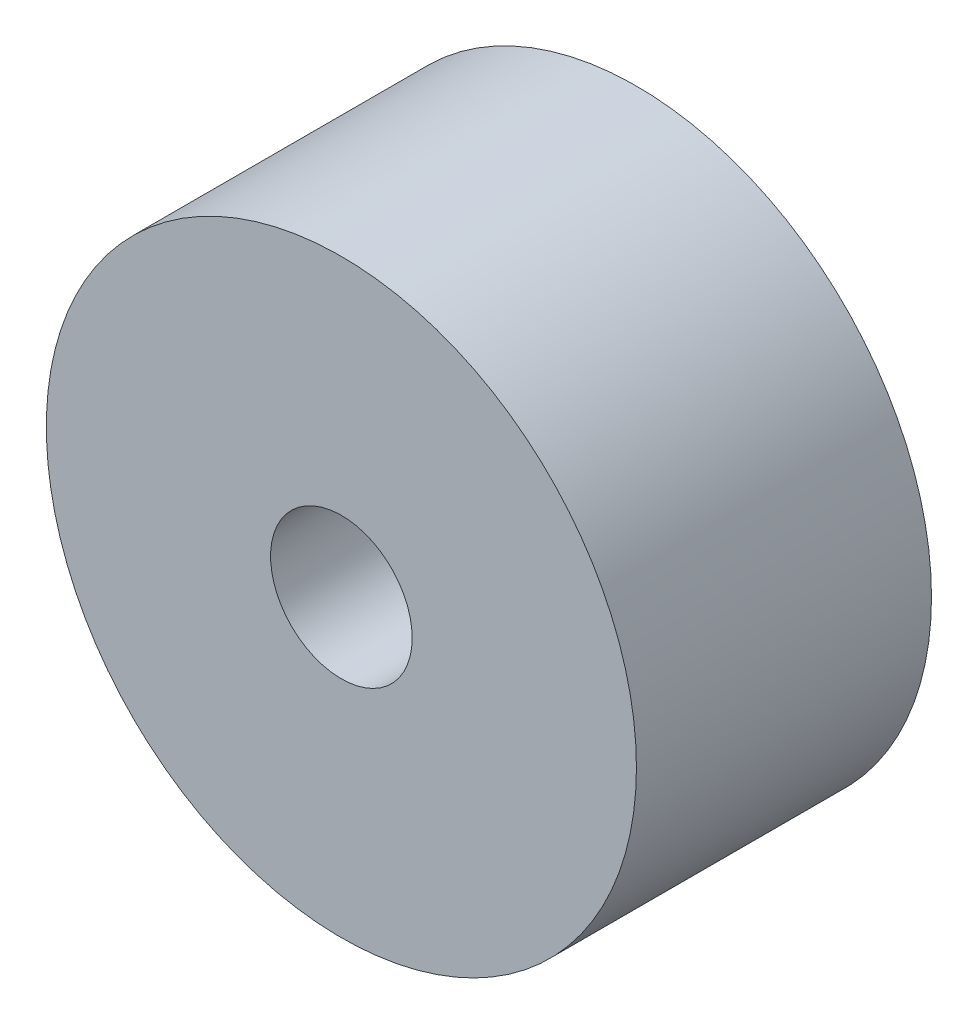
ISO-10303-21;
HEADER;
FILE_DESCRIPTION(('STEP AP214'),'2;1');
FILE_NAME('part.step','',(''),(''),'','','');
FILE_SCHEMA(('AUTOMOTIVE_DESIGN { 1 0 10303 214 1 1 1 1 }'));
ENDSEC;
DATA;
#1=APPLICATION_CONTEXT('core data for automotive mechanical design processes');
#2=APPLICATION_PROTOCOL_DEFINITION('international standard','automotive_design',2000,#1);
#3=PRODUCT_CONTEXT('',#1,'mechanical');
#4=PRODUCT('Part','Part','',(#3));
#5=PRODUCT_RELATED_PRODUCT_CATEGORY('part','',(#4));
#6=PRODUCT_DEFINITION_FORMATION('','',#4);
#7=PRODUCT_DEFINITION_CONTEXT('part definition',#1,'design');
#8=PRODUCT_DEFINITION('design','',#6,#7);
#9=PRODUCT_DEFINITION_SHAPE('','',#8);
#10=(LENGTH_UNIT() NAMED_UNIT(*) SI_UNIT(.MILLI.,.METRE.));
#11=(NAMED_UNIT(*) PLANE_ANGLE_UNIT() SI_UNIT($,.RADIAN.));
#12=(NAMED_UNIT(*) SI_UNIT($,.STERADIAN.) SOLID_ANGLE_UNIT());
#13=UNCERTAINTY_MEASURE_WITH_UNIT(LENGTH_MEASURE(1.E-05),#10,'distance_accuracy_value','');
#14=(GEOMETRIC_REPRESENTATION_CONTEXT(3) GLOBAL_UNCERTAINTY_ASSIGNED_CONTEXT((#13)) GLOBAL_UNIT_ASSIGNED_CONTEXT((#10,
#11,#12)) REPRESENTATION_CONTEXT('',''));
#15=CARTESIAN_POINT('',(0.,0.,0.));
#16=DIRECTION('',(0.,0.,1.));
#17=DIRECTION('',(1.,0.,0.));
#18=AXIS2_PLACEMENT_3D('',#15,#16,#17);
#19=CARTESIAN_POINT('',(0.,0.,5.));
#20=DIRECTION('',(0.,0.,1.));
#21=DIRECTION('',(1.,0.,0.));
#22=AXIS2_PLACEMENT_3D('',#19,#20,#21);
#23=PLANE('',#22);
#24=CARTESIAN_POINT('',(0.,0.,5.));
#25=DIRECTION('',(0.,0.,1.));
#26=DIRECTION('',(1.,0.,0.));
#27=AXIS2_PLACEMENT_3D('',#24,#25,#26);
#28=CIRCLE('',#27,5.);
#29=CARTESIAN_POINT('',(5.,0.,5.));
#30=VERTEX_POINT('',#29);
#31=EDGE_CURVE('E11',#30,#30,#28,.T.);
#32=ORIENTED_EDGE('',*,*,#31,.T.);
#33=EDGE_LOOP('',(#32));
#34=FACE_BOUND('',#33,.T.);
#35=CARTESIAN_POINT('',(0.,0.,5.));
#36=DIRECTION('',(0.,0.,1.));
#37=DIRECTION('',(1.,0.,0.));
#38=AXIS2_PLACEMENT_3D('',#35,#36,#37);
#39=CIRCLE('',#38,1.2);
#40=CARTESIAN_POINT('',(1.2,0.,5.));
#41=VERTEX_POINT('',#40);
#42=EDGE_CURVE('E47',#41,#41,#39,.T.);
#43=ORIENTED_EDGE('',*,*,#42,.F.);
#44=EDGE_LOOP('',(#43));
#45=FACE_BOUND('',#44,.T.);
#46=ADVANCED_FACE('F34',(#34,#45),#23,.T.);
#47=CARTESIAN_POINT('',(0.,0.,0.));
#48=DIRECTION('',(0.,0.,1.));
#49=DIRECTION('',(1.,0.,0.));
#50=AXIS2_PLACEMENT_3D('',#47,#48,#49);
#51=PLANE('',#50);
#52=CARTESIAN_POINT('',(0.,0.,0.));
#53=DIRECTION('',(0.,0.,1.));
#54=DIRECTION('',(1.,0.,0.));
#55=AXIS2_PLACEMENT_3D('',#52,#53,#54);
#56=CIRCLE('',#55,5.);
#57=CARTESIAN_POINT('',(5.,0.,0.));
#58=VERTEX_POINT('',#57);
#59=EDGE_CURVE('E38',#58,#58,#56,.T.);
#60=ORIENTED_EDGE('',*,*,#59,.F.);
#61=EDGE_LOOP('',(#60));
#62=FACE_BOUND('',#61,.T.);
#63=CARTESIAN_POINT('',(0.,0.,0.));
#64=DIRECTION('',(0.,0.,1.));
#65=DIRECTION('',(1.,0.,0.));
#66=AXIS2_PLACEMENT_3D('',#63,#64,#65);
#67=CIRCLE('',#66,1.2);
#68=CARTESIAN_POINT('',(1.2,0.,0.));
#69=VERTEX_POINT('',#68);
#70=EDGE_CURVE('E50',#69,#69,#67,.T.);
#71=ORIENTED_EDGE('',*,*,#70,.T.);
#72=EDGE_LOOP('',(#71));
#73=FACE_BOUND('',#72,.T.);
#74=ADVANCED_FACE('F60',(#62,#73),#51,.F.);
#75=CARTESIAN_POINT('',(0.,0.,5.));
#76=DIRECTION('',(0.,0.,-1.));
#77=DIRECTION('',(-1.,0.,0.));
#78=AXIS2_PLACEMENT_3D('',#75,#76,#77);
#79=CYLINDRICAL_SURFACE('',#78,5.);
#80=ORIENTED_EDGE('',*,*,#31,.F.);
#81=EDGE_LOOP('',(#80));
#82=FACE_BOUND('',#81,.T.);
#83=ORIENTED_EDGE('',*,*,#59,.T.);
#84=EDGE_LOOP('',(#83));
#85=FACE_BOUND('',#84,.T.);
#86=ADVANCED_FACE('F36',(#82,#85),#79,.T.);
#87=CARTESIAN_POINT('',(0.,0.,5.));
#88=DIRECTION('',(0.,0.,-1.));
#89=DIRECTION('',(-1.,0.,0.));
#90=AXIS2_PLACEMENT_3D('',#87,#88,#89);
#91=CYLINDRICAL_SURFACE('',#90,1.2);
#92=ORIENTED_EDGE('',*,*,#42,.T.);
#93=EDGE_LOOP('',(#92));
#94=FACE_BOUND('',#93,.T.);
#95=ORIENTED_EDGE('',*,*,#70,.F.);
#96=EDGE_LOOP('',(#95));
#97=FACE_BOUND('',#96,.T.);
#98=ADVANCED_FACE('F56',(#94,#97),#91,.F.);
#99=CLOSED_SHELL('',(#46,#74,#86,#98));
#100=MANIFOLD_SOLID_BREP('B2',#99);
#101=ADVANCED_BREP_SHAPE_REPRESENTATION('',(#18,#100),#14);
#102=SHAPE_DEFINITION_REPRESENTATION(#9,#101);
ENDSEC;
END-ISO-10303-21;
